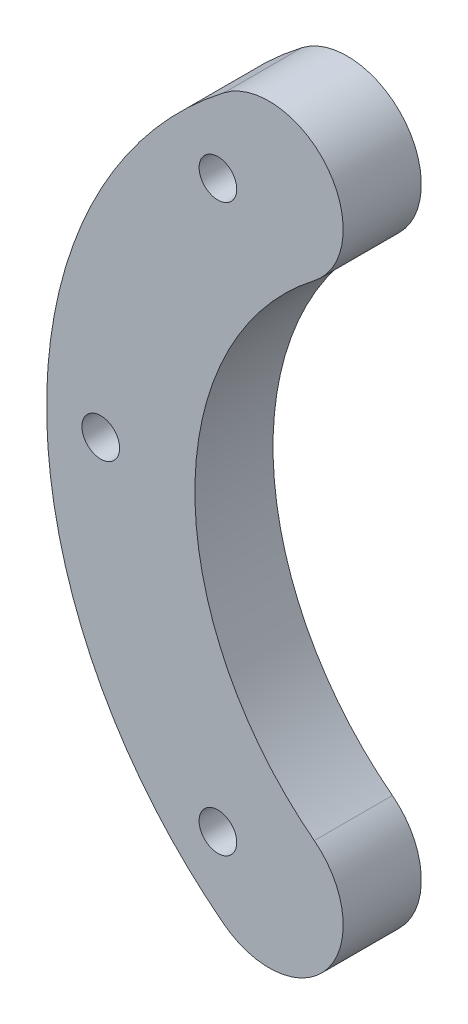
ISO-10303-21;
HEADER;
FILE_DESCRIPTION(('STEP AP214'),'2;1');
FILE_NAME('part.step','',(''),(''),'','','');
FILE_SCHEMA(('AUTOMOTIVE_DESIGN { 1 0 10303 214 1 1 1 1 }'));
ENDSEC;
DATA;
#1=APPLICATION_CONTEXT('core data for automotive mechanical design processes');
#2=APPLICATION_PROTOCOL_DEFINITION('international standard','automotive_design',2000,#1);
#3=PRODUCT_CONTEXT('',#1,'mechanical');
#4=PRODUCT('Part','Part','',(#3));
#5=PRODUCT_RELATED_PRODUCT_CATEGORY('part','',(#4));
#6=PRODUCT_DEFINITION_FORMATION('','',#4);
#7=PRODUCT_DEFINITION_CONTEXT('part definition',#1,'design');
#8=PRODUCT_DEFINITION('design','',#6,#7);
#9=PRODUCT_DEFINITION_SHAPE('','',#8);
#10=(LENGTH_UNIT() NAMED_UNIT(*) SI_UNIT(.MILLI.,.METRE.));
#11=(NAMED_UNIT(*) PLANE_ANGLE_UNIT() SI_UNIT($,.RADIAN.));
#12=(NAMED_UNIT(*) SI_UNIT($,.STERADIAN.) SOLID_ANGLE_UNIT());
#13=UNCERTAINTY_MEASURE_WITH_UNIT(LENGTH_MEASURE(1.E-05),#10,'distance_accuracy_value','');
#14=(GEOMETRIC_REPRESENTATION_CONTEXT(3) GLOBAL_UNCERTAINTY_ASSIGNED_CONTEXT((#13)) GLOBAL_UNIT_ASSIGNED_CONTEXT((#10,
#11,#12)) REPRESENTATION_CONTEXT('',''));
#15=CARTESIAN_POINT('',(0.,0.,0.));
#16=DIRECTION('',(0.,0.,1.));
#17=DIRECTION('',(1.,0.,0.));
#18=AXIS2_PLACEMENT_3D('',#15,#16,#17);
#19=CARTESIAN_POINT('',(0.,0.,8.3));
#20=DIRECTION('',(0.,0.,1.));
#21=DIRECTION('',(1.,0.,0.));
#22=AXIS2_PLACEMENT_3D('',#19,#20,#21);
#23=PLANE('',#22);
#24=CARTESIAN_POINT('',(-30.0520382004284,30.0520382004282,8.3));
#25=DIRECTION('',(0.,0.,1.));
#26=DIRECTION('',(1.,0.,0.));
#27=AXIS2_PLACEMENT_3D('',#24,#25,#26);
#28=CIRCLE('',#27,2.);
#29=CARTESIAN_POINT('',(-28.0520382004284,30.0520382004282,8.3));
#30=VERTEX_POINT('',#29);
#31=EDGE_CURVE('E109',#30,#30,#28,.T.);
#32=ORIENTED_EDGE('',*,*,#31,.F.);
#33=EDGE_LOOP('',(#32));
#34=FACE_BOUND('',#33,.T.);
#35=CARTESIAN_POINT('',(-30.0520382004285,-30.052038200428,8.3));
#36=DIRECTION('',(0.,0.,1.));
#37=DIRECTION('',(1.,0.,0.));
#38=AXIS2_PLACEMENT_3D('',#35,#36,#37);
#39=CIRCLE('',#38,2.);
#40=CARTESIAN_POINT('',(-28.0520382004285,-30.052038200428,8.3));
#41=VERTEX_POINT('',#40);
#42=EDGE_CURVE('E96',#41,#41,#39,.T.);
#43=ORIENTED_EDGE('',*,*,#42,.F.);
#44=EDGE_LOOP('',(#43));
#45=FACE_BOUND('',#44,.T.);
#46=CARTESIAN_POINT('',(-42.5000000000001,-2.28102970004921E-13,8.3));
#47=DIRECTION('',(0.,0.,1.));
#48=DIRECTION('',(1.,0.,0.));
#49=AXIS2_PLACEMENT_3D('',#46,#47,#48);
#50=CIRCLE('',#49,2.);
#51=CARTESIAN_POINT('',(-40.5000000000001,-2.28102970004921E-13,8.3));
#52=VERTEX_POINT('',#51);
#53=EDGE_CURVE('E103',#52,#52,#50,.T.);
#54=ORIENTED_EDGE('',*,*,#53,.F.);
#55=EDGE_LOOP('',(#54));
#56=FACE_BOUND('',#55,.T.);
#57=CARTESIAN_POINT('',(0.,0.,8.3));
#58=DIRECTION('',(0.,0.,1.));
#59=DIRECTION('',(1.,0.,0.));
#60=AXIS2_PLACEMENT_3D('',#57,#58,#59);
#61=CIRCLE('',#60,32.5);
#62=CARTESIAN_POINT('',(-19.8178949442342,25.7585139318885,8.3));
#63=VERTEX_POINT('',#62);
#64=CARTESIAN_POINT('',(-19.8178949442342,-25.7585139318885,8.3));
#65=VERTEX_POINT('',#64);
#66=EDGE_CURVE('E87',#63,#65,#61,.T.);
#67=ORIENTED_EDGE('',*,*,#66,.F.);
#68=CARTESIAN_POINT('',(-24.6199233345679,32.,8.3));
#69=DIRECTION('',(0.,0.,1.));
#70=DIRECTION('',(1.,0.,0.));
#71=AXIS2_PLACEMENT_3D('',#68,#69,#70);
#72=CIRCLE('',#71,7.875);
#73=CARTESIAN_POINT('',(-29.4219517249016,38.2414860681115,8.3));
#74=VERTEX_POINT('',#73);
#75=EDGE_CURVE('E61',#63,#74,#72,.T.);
#76=ORIENTED_EDGE('',*,*,#75,.T.);
#77=CARTESIAN_POINT('',(0.,0.,8.3));
#78=DIRECTION('',(0.,0.,1.));
#79=DIRECTION('',(1.,0.,0.));
#80=AXIS2_PLACEMENT_3D('',#77,#78,#79);
#81=CIRCLE('',#80,48.25);
#82=CARTESIAN_POINT('',(-29.4219517249016,-38.2414860681115,8.3));
#83=VERTEX_POINT('',#82);
#84=EDGE_CURVE('E83',#74,#83,#81,.T.);
#85=ORIENTED_EDGE('',*,*,#84,.T.);
#86=CARTESIAN_POINT('',(-24.6199233345679,-32.,8.3));
#87=DIRECTION('',(0.,0.,1.));
#88=DIRECTION('',(1.,0.,0.));
#89=AXIS2_PLACEMENT_3D('',#86,#87,#88);
#90=CIRCLE('',#89,7.875);
#91=EDGE_CURVE('E77',#83,#65,#90,.T.);
#92=ORIENTED_EDGE('',*,*,#91,.T.);
#93=EDGE_LOOP('',(#67,#76,#85,#92));
#94=FACE_BOUND('',#93,.T.);
#95=ADVANCED_FACE('F38',(#34,#45,#56,#94),#23,.T.);
#96=CARTESIAN_POINT('',(0.,0.,0.));
#97=DIRECTION('',(0.,0.,1.));
#98=DIRECTION('',(1.,0.,0.));
#99=AXIS2_PLACEMENT_3D('',#96,#97,#98);
#100=PLANE('',#99);
#101=CARTESIAN_POINT('',(-30.0520382004284,30.0520382004282,0.));
#102=DIRECTION('',(0.,0.,1.));
#103=DIRECTION('',(1.,0.,0.));
#104=AXIS2_PLACEMENT_3D('',#101,#102,#103);
#105=CIRCLE('',#104,2.);
#106=CARTESIAN_POINT('',(-28.0520382004284,30.0520382004282,0.));
#107=VERTEX_POINT('',#106);
#108=EDGE_CURVE('E112',#107,#107,#105,.T.);
#109=ORIENTED_EDGE('',*,*,#108,.T.);
#110=EDGE_LOOP('',(#109));
#111=FACE_BOUND('',#110,.T.);
#112=CARTESIAN_POINT('',(-42.5000000000001,-2.28102970004921E-13,0.));
#113=DIRECTION('',(0.,0.,1.));
#114=DIRECTION('',(1.,0.,0.));
#115=AXIS2_PLACEMENT_3D('',#112,#113,#114);
#116=CIRCLE('',#115,2.);
#117=CARTESIAN_POINT('',(-40.5000000000001,-2.28102970004921E-13,0.));
#118=VERTEX_POINT('',#117);
#119=EDGE_CURVE('E106',#118,#118,#116,.T.);
#120=ORIENTED_EDGE('',*,*,#119,.T.);
#121=EDGE_LOOP('',(#120));
#122=FACE_BOUND('',#121,.T.);
#123=CARTESIAN_POINT('',(-30.0520382004285,-30.052038200428,0.));
#124=DIRECTION('',(0.,0.,1.));
#125=DIRECTION('',(1.,0.,0.));
#126=AXIS2_PLACEMENT_3D('',#123,#124,#125);
#127=CIRCLE('',#126,2.);
#128=CARTESIAN_POINT('',(-28.0520382004285,-30.052038200428,0.));
#129=VERTEX_POINT('',#128);
#130=EDGE_CURVE('E99',#129,#129,#127,.T.);
#131=ORIENTED_EDGE('',*,*,#130,.T.);
#132=EDGE_LOOP('',(#131));
#133=FACE_BOUND('',#132,.T.);
#134=CARTESIAN_POINT('',(-24.6199233345679,32.,0.));
#135=DIRECTION('',(0.,0.,1.));
#136=DIRECTION('',(1.,0.,0.));
#137=AXIS2_PLACEMENT_3D('',#134,#135,#136);
#138=CIRCLE('',#137,7.875);
#139=CARTESIAN_POINT('',(-19.8178949442342,25.7585139318885,0.));
#140=VERTEX_POINT('',#139);
#141=CARTESIAN_POINT('',(-29.4219517249016,38.2414860681115,0.));
#142=VERTEX_POINT('',#141);
#143=EDGE_CURVE('E115',#140,#142,#138,.T.);
#144=ORIENTED_EDGE('',*,*,#143,.F.);
#145=CARTESIAN_POINT('',(0.,0.,0.));
#146=DIRECTION('',(0.,0.,1.));
#147=DIRECTION('',(1.,0.,0.));
#148=AXIS2_PLACEMENT_3D('',#145,#146,#147);
#149=CIRCLE('',#148,32.5);
#150=CARTESIAN_POINT('',(-19.8178949442342,-25.7585139318886,0.));
#151=VERTEX_POINT('',#150);
#152=EDGE_CURVE('E92',#140,#151,#149,.T.);
#153=ORIENTED_EDGE('',*,*,#152,.T.);
#154=CARTESIAN_POINT('',(-24.6199233345679,-32.,0.));
#155=DIRECTION('',(0.,0.,1.));
#156=DIRECTION('',(1.,0.,0.));
#157=AXIS2_PLACEMENT_3D('',#154,#155,#156);
#158=CIRCLE('',#157,7.875);
#159=CARTESIAN_POINT('',(-29.4219517249016,-38.2414860681115,0.));
#160=VERTEX_POINT('',#159);
#161=EDGE_CURVE('E53',#160,#151,#158,.T.);
#162=ORIENTED_EDGE('',*,*,#161,.F.);
#163=CARTESIAN_POINT('',(0.,0.,0.));
#164=DIRECTION('',(0.,0.,1.));
#165=DIRECTION('',(1.,0.,0.));
#166=AXIS2_PLACEMENT_3D('',#163,#164,#165);
#167=CIRCLE('',#166,48.25);
#168=EDGE_CURVE('E91',#142,#160,#167,.T.);
#169=ORIENTED_EDGE('',*,*,#168,.F.);
#170=EDGE_LOOP('',(#144,#153,#162,#169));
#171=FACE_BOUND('',#170,.T.);
#172=ADVANCED_FACE('F129',(#111,#122,#133,#171),#100,.F.);
#173=CARTESIAN_POINT('',(0.,0.,8.3));
#174=DIRECTION('',(0.,0.,-1.));
#175=DIRECTION('',(-1.,0.,0.));
#176=AXIS2_PLACEMENT_3D('',#173,#174,#175);
#177=CYLINDRICAL_SURFACE('',#176,48.25);
#178=DIRECTION('',(0.,0.,1.));
#179=VECTOR('',#178,1.);
#180=CARTESIAN_POINT('',(-29.4219517249016,38.2414860681115,-37.7));
#181=LINE('',#180,#179);
#182=EDGE_CURVE('E120',#142,#74,#181,.T.);
#183=ORIENTED_EDGE('',*,*,#182,.F.);
#184=ORIENTED_EDGE('',*,*,#168,.T.);
#185=DIRECTION('',(0.,0.,1.));
#186=VECTOR('',#185,1.);
#187=CARTESIAN_POINT('',(-29.4219517249016,-38.2414860681115,-37.7));
#188=LINE('',#187,#186);
#189=EDGE_CURVE('E121',#160,#83,#188,.T.);
#190=ORIENTED_EDGE('',*,*,#189,.T.);
#191=ORIENTED_EDGE('',*,*,#84,.F.);
#192=EDGE_LOOP('',(#183,#184,#190,#191));
#193=FACE_BOUND('',#192,.T.);
#194=ADVANCED_FACE('F40',(#193),#177,.T.);
#195=CARTESIAN_POINT('',(0.,0.,8.3));
#196=DIRECTION('',(0.,0.,-1.));
#197=DIRECTION('',(-1.,0.,0.));
#198=AXIS2_PLACEMENT_3D('',#195,#196,#197);
#199=CYLINDRICAL_SURFACE('',#198,32.5);
#200=ORIENTED_EDGE('',*,*,#152,.F.);
#201=DIRECTION('',(0.,0.,1.));
#202=VECTOR('',#201,1.);
#203=CARTESIAN_POINT('',(-19.8178949442342,25.7585139318885,-14.7));
#204=LINE('',#203,#202);
#205=EDGE_CURVE('E11',#140,#63,#204,.T.);
#206=ORIENTED_EDGE('',*,*,#205,.T.);
#207=ORIENTED_EDGE('',*,*,#66,.T.);
#208=DIRECTION('',(0.,0.,1.));
#209=VECTOR('',#208,1.);
#210=CARTESIAN_POINT('',(-19.8178949442342,-25.7585139318885,-14.7));
#211=LINE('',#210,#209);
#212=EDGE_CURVE('E46',#151,#65,#211,.T.);
#213=ORIENTED_EDGE('',*,*,#212,.F.);
#214=EDGE_LOOP('',(#200,#206,#207,#213));
#215=FACE_BOUND('',#214,.T.);
#216=ADVANCED_FACE('F90',(#215),#199,.F.);
#217=CARTESIAN_POINT('',(-30.0520382004285,-30.052038200428,8.3));
#218=DIRECTION('',(0.,0.,-1.));
#219=DIRECTION('',(-1.,0.,0.));
#220=AXIS2_PLACEMENT_3D('',#217,#218,#219);
#221=CYLINDRICAL_SURFACE('',#220,2.);
#222=ORIENTED_EDGE('',*,*,#42,.T.);
#223=EDGE_LOOP('',(#222));
#224=FACE_BOUND('',#223,.T.);
#225=ORIENTED_EDGE('',*,*,#130,.F.);
#226=EDGE_LOOP('',(#225));
#227=FACE_BOUND('',#226,.T.);
#228=ADVANCED_FACE('F150',(#224,#227),#221,.F.);
#229=CARTESIAN_POINT('',(-42.5000000000001,-2.28102970004921E-13,8.3));
#230=DIRECTION('',(0.,0.,-1.));
#231=DIRECTION('',(-1.,0.,0.));
#232=AXIS2_PLACEMENT_3D('',#229,#230,#231);
#233=CYLINDRICAL_SURFACE('',#232,2.);
#234=ORIENTED_EDGE('',*,*,#53,.T.);
#235=EDGE_LOOP('',(#234));
#236=FACE_BOUND('',#235,.T.);
#237=ORIENTED_EDGE('',*,*,#119,.F.);
#238=EDGE_LOOP('',(#237));
#239=FACE_BOUND('',#238,.T.);
#240=ADVANCED_FACE('F153',(#236,#239),#233,.F.);
#241=CARTESIAN_POINT('',(-30.0520382004284,30.0520382004282,8.3));
#242=DIRECTION('',(0.,0.,-1.));
#243=DIRECTION('',(-1.,0.,0.));
#244=AXIS2_PLACEMENT_3D('',#241,#242,#243);
#245=CYLINDRICAL_SURFACE('',#244,2.);
#246=ORIENTED_EDGE('',*,*,#31,.T.);
#247=EDGE_LOOP('',(#246));
#248=FACE_BOUND('',#247,.T.);
#249=ORIENTED_EDGE('',*,*,#108,.F.);
#250=EDGE_LOOP('',(#249));
#251=FACE_BOUND('',#250,.T.);
#252=ADVANCED_FACE('F136',(#248,#251),#245,.F.);
#253=CARTESIAN_POINT('',(-24.6199233345679,-32.,-37.7));
#254=DIRECTION('',(0.,0.,1.));
#255=DIRECTION('',(1.,0.,0.));
#256=AXIS2_PLACEMENT_3D('',#253,#254,#255);
#257=CYLINDRICAL_SURFACE('',#256,7.875);
#258=ORIENTED_EDGE('',*,*,#161,.T.);
#259=ORIENTED_EDGE('',*,*,#212,.T.);
#260=ORIENTED_EDGE('',*,*,#91,.F.);
#261=ORIENTED_EDGE('',*,*,#189,.F.);
#262=EDGE_LOOP('',(#258,#259,#260,#261));
#263=FACE_BOUND('',#262,.T.);
#264=ADVANCED_FACE('F76',(#263),#257,.T.);
#265=CARTESIAN_POINT('',(-24.6199233345679,32.,-37.7));
#266=DIRECTION('',(0.,0.,1.));
#267=DIRECTION('',(1.,0.,0.));
#268=AXIS2_PLACEMENT_3D('',#265,#266,#267);
#269=CYLINDRICAL_SURFACE('',#268,7.875);
#270=ORIENTED_EDGE('',*,*,#143,.T.);
#271=ORIENTED_EDGE('',*,*,#182,.T.);
#272=ORIENTED_EDGE('',*,*,#75,.F.);
#273=ORIENTED_EDGE('',*,*,#205,.F.);
#274=EDGE_LOOP('',(#270,#271,#272,#273));
#275=FACE_BOUND('',#274,.T.);
#276=ADVANCED_FACE('F130',(#275),#269,.T.);
#277=CLOSED_SHELL('',(#95,#172,#194,#216,#228,#240,#252,#264,#276));
#278=MANIFOLD_SOLID_BREP('B2',#277);
#279=ADVANCED_BREP_SHAPE_REPRESENTATION('',(#18,#278),#14);
#280=SHAPE_DEFINITION_REPRESENTATION(#9,#279);
ENDSEC;
END-ISO-10303-21;
